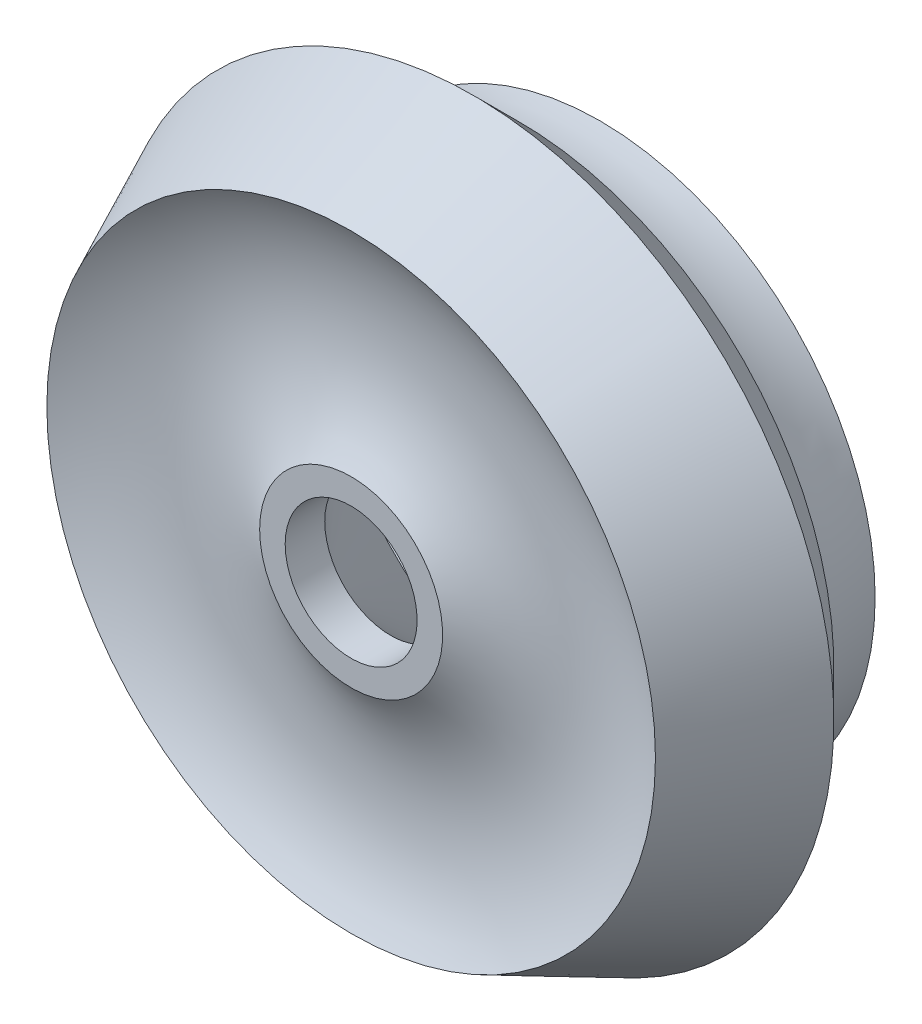
ISO-10303-21;
HEADER;
FILE_DESCRIPTION(('STEP AP214'),'2;1');
FILE_NAME('part.step','',(''),(''),'','','');
FILE_SCHEMA(('AUTOMOTIVE_DESIGN { 1 0 10303 214 1 1 1 1 }'));
ENDSEC;
DATA;
#1=APPLICATION_CONTEXT('core data for automotive mechanical design processes');
#2=APPLICATION_PROTOCOL_DEFINITION('international standard','automotive_design',2000,#1);
#3=PRODUCT_CONTEXT('',#1,'mechanical');
#4=PRODUCT('Part','Part','',(#3));
#5=PRODUCT_RELATED_PRODUCT_CATEGORY('part','',(#4));
#6=PRODUCT_DEFINITION_FORMATION('','',#4);
#7=PRODUCT_DEFINITION_CONTEXT('part definition',#1,'design');
#8=PRODUCT_DEFINITION('design','',#6,#7);
#9=PRODUCT_DEFINITION_SHAPE('','',#8);
#10=(LENGTH_UNIT() NAMED_UNIT(*) SI_UNIT(.MILLI.,.METRE.));
#11=(NAMED_UNIT(*) PLANE_ANGLE_UNIT() SI_UNIT($,.RADIAN.));
#12=(NAMED_UNIT(*) SI_UNIT($,.STERADIAN.) SOLID_ANGLE_UNIT());
#13=UNCERTAINTY_MEASURE_WITH_UNIT(LENGTH_MEASURE(1.E-05),#10,'distance_accuracy_value','');
#14=(GEOMETRIC_REPRESENTATION_CONTEXT(3) GLOBAL_UNCERTAINTY_ASSIGNED_CONTEXT((#13)) GLOBAL_UNIT_ASSIGNED_CONTEXT((#10,
#11,#12)) REPRESENTATION_CONTEXT('',''));
#15=CARTESIAN_POINT('',(0.,0.,0.));
#16=DIRECTION('',(0.,0.,1.));
#17=DIRECTION('',(1.,0.,0.));
#18=AXIS2_PLACEMENT_3D('',#15,#16,#17);
#19=CARTESIAN_POINT('',(0.,0.,-368.527464887786));
#20=DIRECTION('',(0.,0.,-1.));
#21=DIRECTION('',(-1.,0.,0.));
#22=AXIS2_PLACEMENT_3D('',#19,#20,#21);
#23=DEGENERATE_TOROIDAL_SURFACE('',#22,150.,150.,.T.);
#24=CARTESIAN_POINT('',(0.,0.,-495.));
#25=DIRECTION('',(0.,0.,-1.));
#26=DIRECTION('',(-1.,0.,0.));
#27=AXIS2_PLACEMENT_3D('',#24,#25,#26);
#28=CIRCLE('',#27,69.3482928742995);
#29=CARTESIAN_POINT('',(-69.3482928742995,0.,-495.));
#30=VERTEX_POINT('',#29);
#31=EDGE_CURVE('E10',#30,#30,#28,.T.);
#32=ORIENTED_EDGE('',*,*,#31,.T.);
#33=EDGE_LOOP('',(#32));
#34=FACE_BOUND('',#33,.T.);
#35=CARTESIAN_POINT('',(0.,0.,-495.));
#36=DIRECTION('',(0.,0.,-1.));
#37=DIRECTION('',(-1.,0.,0.));
#38=AXIS2_PLACEMENT_3D('',#35,#36,#37);
#39=CIRCLE('',#38,230.651707125701);
#40=CARTESIAN_POINT('',(-230.651707125701,0.,-495.));
#41=VERTEX_POINT('',#40);
#42=EDGE_CURVE('E69',#41,#41,#39,.T.);
#43=ORIENTED_EDGE('',*,*,#42,.F.);
#44=EDGE_LOOP('',(#43));
#45=FACE_BOUND('',#44,.T.);
#46=ADVANCED_FACE('F35',(#34,#45),#23,.F.);
#47=CARTESIAN_POINT('',(0.,69.3482928742995,-494.999999999999));
#48=DIRECTION('',(0.,0.,1.));
#49=DIRECTION('',(1.,0.,0.));
#50=AXIS2_PLACEMENT_3D('',#47,#48,#49);
#51=PLANE('',#50);
#52=CARTESIAN_POINT('',(0.,0.,-494.999999999999));
#53=DIRECTION('',(0.,0.,-1.));
#54=DIRECTION('',(-1.,0.,0.));
#55=AXIS2_PLACEMENT_3D('',#52,#53,#54);
#56=CIRCLE('',#55,49.9999999999992);
#57=CARTESIAN_POINT('',(-49.9999999999992,0.,-494.999999999999));
#58=VERTEX_POINT('',#57);
#59=EDGE_CURVE('E41',#58,#58,#56,.T.);
#60=ORIENTED_EDGE('',*,*,#59,.T.);
#61=EDGE_LOOP('',(#60));
#62=FACE_BOUND('',#61,.T.);
#63=ORIENTED_EDGE('',*,*,#31,.F.);
#64=EDGE_LOOP('',(#63));
#65=FACE_BOUND('',#64,.T.);
#66=ADVANCED_FACE('F77',(#62,#65),#51,.T.);
#67=CARTESIAN_POINT('',(0.,0.,-546.1));
#68=DIRECTION('',(0.,0.,-1.));
#69=DIRECTION('',(-1.,0.,0.));
#70=AXIS2_PLACEMENT_3D('',#67,#68,#69);
#71=CYLINDRICAL_SURFACE('',#70,49.9999999999993);
#72=CARTESIAN_POINT('',(0.,0.,-524.999999999999));
#73=DIRECTION('',(0.,0.,-1.));
#74=DIRECTION('',(-1.,0.,0.));
#75=AXIS2_PLACEMENT_3D('',#72,#73,#74);
#76=CIRCLE('',#75,49.9999999999994);
#77=CARTESIAN_POINT('',(-49.9999999999993,0.,-524.999999999999));
#78=VERTEX_POINT('',#77);
#79=EDGE_CURVE('E45',#78,#78,#76,.T.);
#80=ORIENTED_EDGE('',*,*,#79,.T.);
#81=EDGE_LOOP('',(#80));
#82=FACE_BOUND('',#81,.T.);
#83=ORIENTED_EDGE('',*,*,#59,.F.);
#84=EDGE_LOOP('',(#83));
#85=FACE_BOUND('',#84,.T.);
#86=ADVANCED_FACE('F81',(#82,#85),#71,.F.);
#87=CARTESIAN_POINT('',(0.,0.,-524.999999999999));
#88=DIRECTION('',(0.,0.,-1.));
#89=DIRECTION('',(-1.,0.,0.));
#90=AXIS2_PLACEMENT_3D('',#87,#88,#89);
#91=CONICAL_SURFACE('',#90,49.9999999999994,0.78539816339745);
#92=CARTESIAN_POINT('',(0.,0.,-658.847763108502));
#93=DIRECTION('',(0.,0.,-1.));
#94=DIRECTION('',(-1.,0.,0.));
#95=AXIS2_PLACEMENT_3D('',#92,#93,#94);
#96=CIRCLE('',#95,183.847763108503);
#97=CARTESIAN_POINT('',(-183.847763108503,0.,-658.847763108502));
#98=VERTEX_POINT('',#97);
#99=EDGE_CURVE('E49',#98,#98,#96,.T.);
#100=CARTESIAN_POINT('',(-183.847763108503,0.,-658.847763108502));
#101=CARTESIAN_POINT('',(-182.453515576122,0.,-657.453515576122));
#102=CARTESIAN_POINT('',(-181.059268043742,0.,-656.059268043741));
#103=CARTESIAN_POINT('',(-178.270772978982,0.,-653.270772978981));
#104=CARTESIAN_POINT('',(-176.876525446601,0.,-651.876525446601));
#105=CARTESIAN_POINT('',(-174.088030381841,0.,-649.08803038184));
#106=CARTESIAN_POINT('',(-172.693782849461,0.,-647.69378284946));
#107=CARTESIAN_POINT('',(-169.9052877847,0.,-644.9052877847));
#108=CARTESIAN_POINT('',(-168.51104025232,0.,-643.511040252319));
#109=CARTESIAN_POINT('',(-165.72254518756,0.,-640.722545187559));
#110=CARTESIAN_POINT('',(-164.328297655179,0.,-639.328297655179));
#111=CARTESIAN_POINT('',(-161.539802590419,0.,-636.539802590418));
#112=CARTESIAN_POINT('',(-160.145555058039,0.,-635.145555058038));
#113=CARTESIAN_POINT('',(-157.357059993278,0.,-632.357059993277));
#114=CARTESIAN_POINT('',(-155.962812460898,0.,-630.962812460897));
#115=CARTESIAN_POINT('',(-153.174317396137,0.,-628.174317396137));
#116=CARTESIAN_POINT('',(-151.780069863757,0.,-626.780069863756));
#117=CARTESIAN_POINT('',(-148.991574798997,0.,-623.991574798996));
#118=CARTESIAN_POINT('',(-147.597327266616,0.,-622.597327266616));
#119=CARTESIAN_POINT('',(-144.808832201856,0.,-619.808832201855));
#120=CARTESIAN_POINT('',(-143.414584669476,0.,-618.414584669475));
#121=CARTESIAN_POINT('',(-140.626089604715,0.,-615.626089604715));
#122=CARTESIAN_POINT('',(-139.231842072335,0.,-614.231842072334));
#123=CARTESIAN_POINT('',(-136.443347007574,0.,-611.443347007574));
#124=CARTESIAN_POINT('',(-135.049099475194,0.,-610.049099475194));
#125=CARTESIAN_POINT('',(-132.260604410434,0.,-607.260604410433));
#126=CARTESIAN_POINT('',(-130.866356878053,0.,-605.866356878053));
#127=CARTESIAN_POINT('',(-128.077861813293,0.,-603.077861813292));
#128=CARTESIAN_POINT('',(-126.683614280913,0.,-601.683614280912));
#129=CARTESIAN_POINT('',(-123.895119216152,0.,-598.895119216152));
#130=CARTESIAN_POINT('',(-122.500871683772,0.,-597.500871683771));
#131=CARTESIAN_POINT('',(-119.712376619011,0.,-594.712376619011));
#132=CARTESIAN_POINT('',(-118.318129086631,0.,-593.318129086631));
#133=CARTESIAN_POINT('',(-115.529634021871,0.,-590.52963402187));
#134=CARTESIAN_POINT('',(-114.135386489491,0.,-589.13538648949));
#135=CARTESIAN_POINT('',(-111.34689142473,0.,-586.34689142473));
#136=CARTESIAN_POINT('',(-109.95264389235,0.,-584.952643892349));
#137=CARTESIAN_POINT('',(-107.164148827589,0.,-582.164148827589));
#138=CARTESIAN_POINT('',(-105.769901295209,0.,-580.769901295209));
#139=CARTESIAN_POINT('',(-102.981406230449,0.,-577.981406230448));
#140=CARTESIAN_POINT('',(-101.587158698068,0.,-576.587158698068));
#141=CARTESIAN_POINT('',(-98.7986636333078,0.,-573.798663633307));
#142=CARTESIAN_POINT('',(-97.4044161009276,0.,-572.404416100927));
#143=CARTESIAN_POINT('',(-94.6159210361671,0.,-569.615921036167));
#144=CARTESIAN_POINT('',(-93.2216735037869,0.,-568.221673503787));
#145=CARTESIAN_POINT('',(-90.4331784390264,0.,-565.433178439026));
#146=CARTESIAN_POINT('',(-89.0389309066461,0.,-564.038930906646));
#147=CARTESIAN_POINT('',(-86.2504358418856,0.,-561.250435841885));
#148=CARTESIAN_POINT('',(-84.8561883095054,0.,-559.856188309505));
#149=CARTESIAN_POINT('',(-82.0676932447449,0.,-557.067693244745));
#150=CARTESIAN_POINT('',(-80.6734457123647,0.,-555.673445712364));
#151=CARTESIAN_POINT('',(-77.8849506476042,0.,-552.884950647604));
#152=CARTESIAN_POINT('',(-76.490703115224,0.,-551.490703115224));
#153=CARTESIAN_POINT('',(-73.7022080504635,0.,-548.702208050463));
#154=CARTESIAN_POINT('',(-72.3079605180832,0.,-547.307960518083));
#155=CARTESIAN_POINT('',(-69.5194654533227,0.,-544.519465453322));
#156=CARTESIAN_POINT('',(-68.1252179209425,0.,-543.125217920942));
#157=CARTESIAN_POINT('',(-65.336722856182,0.,-540.336722856182));
#158=CARTESIAN_POINT('',(-63.9424753238018,0.,-538.942475323801));
#159=CARTESIAN_POINT('',(-61.1539802590413,0.,-536.153980259041));
#160=CARTESIAN_POINT('',(-59.759732726661,0.,-534.759732726661));
#161=CARTESIAN_POINT('',(-56.9712376619005,0.,-531.9712376619));
#162=CARTESIAN_POINT('',(-55.5769901295203,0.,-530.57699012952));
#163=CARTESIAN_POINT('',(-52.7884950647598,0.,-527.78849506476));
#164=CARTESIAN_POINT('',(-51.3942475323796,0.,-526.394247532379));
#165=CARTESIAN_POINT('',(-49.9999999999993,0.,-524.999999999999));
#166=B_SPLINE_CURVE_WITH_KNOTS('',3,(#100,#101,#102,#103,#104,#105,#106,#107,#108,#109,#110,
#111,#112,#113,#114,#115,#116,#117,#118,#119,#120,#121,#122,#123,#124,#125,#126,#127,#128,#129,
#130,#131,#132,#133,#134,#135,#136,#137,#138,#139,#140,#141,#142,#143,#144,#145,#146,#147,#148,
#149,#150,#151,#152,#153,#154,#155,#156,#157,#158,#159,#160,#161,#162,#163,#164,#165),
.UNSPECIFIED.,.F.,.F.,(4,2,2,2,2,2,2,2,2,2,2,2,2,2,2,2,2,2,2,2,2,2,2,2,2,2,2,2,2,2,2,2,4),(0.,
5.91529130879204,11.8305826175841,17.7458739263761,23.6611652351682,29.5764565439603,
35.4917478527524,41.4070391615444,47.3223304703366,53.2376217791286,59.1529130879207,
65.0682043967127,70.9834957055048,76.8987870142969,82.814078323089,88.729369631881,
94.6446609406732,100.559952249465,106.475243558257,112.390534867049,118.305826175841,
124.221117484634,130.136408793426,136.051700102218,141.96699141101,147.882282719802,
153.797574028594,159.712865337386,165.628156646178,171.54344795497,177.458739263762,
183.374030572554,189.289321881346),.UNSPECIFIED.);
#167=EDGE_CURVE('BSEAM85',#98,#78,#166,.T.);
#168=ORIENTED_EDGE('',*,*,#99,.T.);
#169=ORIENTED_EDGE('',*,*,#79,.F.);
#170=ORIENTED_EDGE('',*,*,#167,.T.);
#171=ORIENTED_EDGE('',*,*,#167,.F.);
#172=EDGE_LOOP('',(#168,#170,#169,#171));
#173=FACE_BOUND('',#172,.T.);
#174=ADVANCED_FACE('F85',(#173),#91,.F.);
#175=CARTESIAN_POINT('',(0.,0.,-475.));
#176=DIRECTION('',(0.,0.,-1.));
#177=DIRECTION('',(0.,1.,0.));
#178=AXIS2_PLACEMENT_3D('',#175,#176,#177);
#179=SPHERICAL_SURFACE('',#178,260.);
#180=CARTESIAN_POINT('',(0.,0.,-683.596500450031));
#181=DIRECTION('',(0.,0.,-1.));
#182=DIRECTION('',(-1.,0.,0.));
#183=AXIS2_PLACEMENT_3D('',#180,#181,#182);
#184=CIRCLE('',#183,155.201481951688);
#185=CARTESIAN_POINT('',(-155.201481951688,0.,-683.596500450031));
#186=VERTEX_POINT('',#185);
#187=EDGE_CURVE('E54',#186,#186,#184,.T.);
#188=ORIENTED_EDGE('',*,*,#187,.T.);
#189=EDGE_LOOP('',(#188));
#190=FACE_BOUND('',#189,.T.);
#191=ORIENTED_EDGE('',*,*,#99,.F.);
#192=EDGE_LOOP('',(#191));
#193=FACE_BOUND('',#192,.T.);
#194=ADVANCED_FACE('F92',(#190,#193),#179,.F.);
#195=CARTESIAN_POINT('',(0.,208.596500450032,-683.596500450031));
#196=DIRECTION('',(0.,0.,-1.));
#197=DIRECTION('',(-1.,0.,0.));
#198=AXIS2_PLACEMENT_3D('',#195,#196,#197);
#199=PLANE('',#198);
#200=CARTESIAN_POINT('',(0.,0.,-683.596500450031));
#201=DIRECTION('',(0.,0.,-1.));
#202=DIRECTION('',(-1.,0.,0.));
#203=AXIS2_PLACEMENT_3D('',#200,#201,#202);
#204=CIRCLE('',#203,208.596500450032);
#205=CARTESIAN_POINT('',(-208.596500450032,0.,-683.596500450031));
#206=VERTEX_POINT('',#205);
#207=EDGE_CURVE('E57',#206,#206,#204,.T.);
#208=ORIENTED_EDGE('',*,*,#207,.T.);
#209=EDGE_LOOP('',(#208));
#210=FACE_BOUND('',#209,.T.);
#211=ORIENTED_EDGE('',*,*,#187,.F.);
#212=EDGE_LOOP('',(#211));
#213=FACE_BOUND('',#212,.T.);
#214=ADVANCED_FACE('F96',(#210,#213),#199,.T.);
#215=CARTESIAN_POINT('',(0.,0.,-667.668203621613));
#216=DIRECTION('',(0.,0.,-1.));
#217=DIRECTION('',(-1.,0.,0.));
#218=AXIS2_PLACEMENT_3D('',#215,#216,#217);
#219=TOROIDAL_SURFACE('',#218,327.534674978422,120.);
#220=CARTESIAN_POINT('',(0.,0.,-606.825613004262));
#221=DIRECTION('',(0.,0.,-1.));
#222=DIRECTION('',(-1.,0.,0.));
#223=AXIS2_PLACEMENT_3D('',#220,#221,#222);
#224=CIRCLE('',#223,224.102672353657);
#225=CARTESIAN_POINT('',(-224.102672353657,0.,-606.825613004262));
#226=VERTEX_POINT('',#225);
#227=EDGE_CURVE('E60',#226,#226,#224,.T.);
#228=ORIENTED_EDGE('',*,*,#227,.T.);
#229=EDGE_LOOP('',(#228));
#230=FACE_BOUND('',#229,.T.);
#231=ORIENTED_EDGE('',*,*,#207,.F.);
#232=EDGE_LOOP('',(#231));
#233=FACE_BOUND('',#232,.T.);
#234=ADVANCED_FACE('F100',(#230,#233),#219,.F.);
#235=CARTESIAN_POINT('',(0.,0.,-606.825613004262));
#236=DIRECTION('',(0.,0.,-1.));
#237=DIRECTION('',(-1.,0.,0.));
#238=AXIS2_PLACEMENT_3D('',#235,#236,#237);
#239=CONICAL_SURFACE('',#238,224.102672353657,0.78539816339745);
#240=CARTESIAN_POINT('',(0.,0.,-621.822687178207));
#241=DIRECTION('',(0.,0.,-1.));
#242=DIRECTION('',(-1.,0.,0.));
#243=AXIS2_PLACEMENT_3D('',#240,#241,#242);
#244=CIRCLE('',#243,239.099746527603);
#245=CARTESIAN_POINT('',(-239.099746527603,0.,-621.822687178207));
#246=VERTEX_POINT('',#245);
#247=EDGE_CURVE('E63',#246,#246,#244,.T.);
#248=ORIENTED_EDGE('',*,*,#247,.T.);
#249=EDGE_LOOP('',(#248));
#250=FACE_BOUND('',#249,.T.);
#251=ORIENTED_EDGE('',*,*,#227,.F.);
#252=EDGE_LOOP('',(#251));
#253=FACE_BOUND('',#252,.T.);
#254=ADVANCED_FACE('F104',(#250,#253),#239,.F.);
#255=CARTESIAN_POINT('',(0.,0.,-621.822687178207));
#256=DIRECTION('',(0.,0.,1.));
#257=DIRECTION('',(1.,0.,0.));
#258=AXIS2_PLACEMENT_3D('',#255,#256,#257);
#259=CONICAL_SURFACE('',#258,239.099746527603,0.785398163397405);
#260=CARTESIAN_POINT('',(0.,0.,-587.274308734664));
#261=DIRECTION('',(0.,0.,-1.));
#262=DIRECTION('',(-1.,0.,0.));
#263=AXIS2_PLACEMENT_3D('',#260,#261,#262);
#264=CIRCLE('',#263,273.648124971143);
#265=CARTESIAN_POINT('',(-273.648124971143,0.,-587.274308734664));
#266=VERTEX_POINT('',#265);
#267=EDGE_CURVE('E66',#266,#266,#264,.T.);
#268=ORIENTED_EDGE('',*,*,#267,.T.);
#269=EDGE_LOOP('',(#268));
#270=FACE_BOUND('',#269,.T.);
#271=ORIENTED_EDGE('',*,*,#247,.F.);
#272=EDGE_LOOP('',(#271));
#273=FACE_BOUND('',#272,.T.);
#274=ADVANCED_FACE('F108',(#270,#273),#259,.T.);
#275=CARTESIAN_POINT('',(0.,0.,-587.274308734664));
#276=DIRECTION('',(0.,0.,-1.));
#277=DIRECTION('',(-1.,0.,0.));
#278=AXIS2_PLACEMENT_3D('',#275,#276,#277);
#279=CONICAL_SURFACE('',#278,273.648124971143,0.436049212280047);
#280=ORIENTED_EDGE('',*,*,#42,.T.);
#281=EDGE_LOOP('',(#280));
#282=FACE_BOUND('',#281,.T.);
#283=ORIENTED_EDGE('',*,*,#267,.F.);
#284=EDGE_LOOP('',(#283));
#285=FACE_BOUND('',#284,.T.);
#286=ADVANCED_FACE('F73',(#282,#285),#279,.T.);
#287=CLOSED_SHELL('',(#46,#66,#86,#174,#194,#214,#234,#254,#274,#286));
#288=MANIFOLD_SOLID_BREP('B2',#287);
#289=ADVANCED_BREP_SHAPE_REPRESENTATION('',(#18,#288),#14);
#290=SHAPE_DEFINITION_REPRESENTATION(#9,#289);
ENDSEC;
END-ISO-10303-21;
